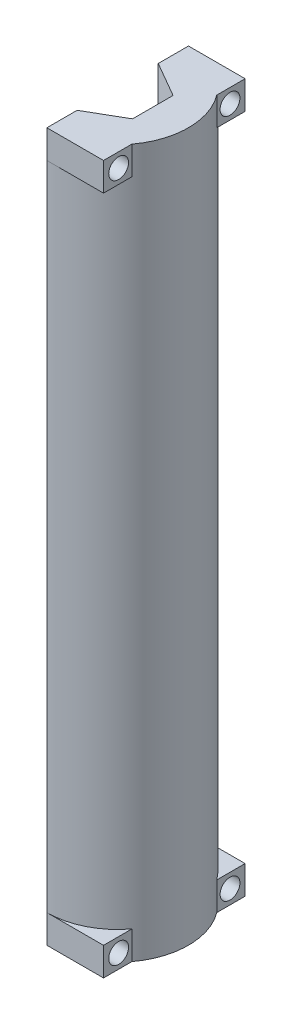
ISO-10303-21;
HEADER;
FILE_DESCRIPTION(('STEP AP214'),'2;1');
FILE_NAME('part.step','',(''),(''),'','','');
FILE_SCHEMA(('AUTOMOTIVE_DESIGN { 1 0 10303 214 1 1 1 1 }'));
ENDSEC;
DATA;
#1=APPLICATION_CONTEXT('core data for automotive mechanical design processes');
#2=APPLICATION_PROTOCOL_DEFINITION('international standard','automotive_design',2000,#1);
#3=PRODUCT_CONTEXT('',#1,'mechanical');
#4=PRODUCT('Part','Part','',(#3));
#5=PRODUCT_RELATED_PRODUCT_CATEGORY('part','',(#4));
#6=PRODUCT_DEFINITION_FORMATION('','',#4);
#7=PRODUCT_DEFINITION_CONTEXT('part definition',#1,'design');
#8=PRODUCT_DEFINITION('design','',#6,#7);
#9=PRODUCT_DEFINITION_SHAPE('','',#8);
#10=(LENGTH_UNIT() NAMED_UNIT(*) SI_UNIT(.MILLI.,.METRE.));
#11=(NAMED_UNIT(*) PLANE_ANGLE_UNIT() SI_UNIT($,.RADIAN.));
#12=(NAMED_UNIT(*) SI_UNIT($,.STERADIAN.) SOLID_ANGLE_UNIT());
#13=UNCERTAINTY_MEASURE_WITH_UNIT(LENGTH_MEASURE(1.E-05),#10,'distance_accuracy_value','');
#14=(GEOMETRIC_REPRESENTATION_CONTEXT(3) GLOBAL_UNCERTAINTY_ASSIGNED_CONTEXT((#13)) GLOBAL_UNIT_ASSIGNED_CONTEXT((#10,
#11,#12)) REPRESENTATION_CONTEXT('',''));
#15=CARTESIAN_POINT('',(0.,0.,0.));
#16=DIRECTION('',(0.,0.,1.));
#17=DIRECTION('',(1.,0.,0.));
#18=AXIS2_PLACEMENT_3D('',#15,#16,#17);
#19=CARTESIAN_POINT('',(0.,75.,0.));
#20=DIRECTION('',(0.,-1.,0.));
#21=DIRECTION('',(0.,0.,-1.));
#22=AXIS2_PLACEMENT_3D('',#19,#20,#21);
#23=CYLINDRICAL_SURFACE('',#22,7.5);
#24=CARTESIAN_POINT('',(0.,72.,0.));
#25=DIRECTION('',(0.,1.,0.));
#26=DIRECTION('',(0.,0.,1.));
#27=AXIS2_PLACEMENT_3D('',#24,#25,#26);
#28=CIRCLE('',#27,7.5);
#29=CARTESIAN_POINT('',(0.,72.,7.5));
#30=VERTEX_POINT('',#29);
#31=CARTESIAN_POINT('',(6.,72.,4.5));
#32=VERTEX_POINT('',#31);
#33=EDGE_CURVE('E178',#30,#32,#28,.T.);
#34=ORIENTED_EDGE('',*,*,#33,.F.);
#35=DIRECTION('',(0.,-1.,0.));
#36=VECTOR('',#35,1.);
#37=CARTESIAN_POINT('',(0.,75.,7.5));
#38=LINE('',#37,#36);
#39=CARTESIAN_POINT('',(0.,3.,7.5));
#40=VERTEX_POINT('',#39);
#41=EDGE_CURVE('E261',#30,#40,#38,.T.);
#42=ORIENTED_EDGE('',*,*,#41,.T.);
#43=CARTESIAN_POINT('',(0.,3.,0.));
#44=DIRECTION('',(0.,-1.,0.));
#45=DIRECTION('',(0.,0.,-1.));
#46=AXIS2_PLACEMENT_3D('',#43,#44,#45);
#47=CIRCLE('',#46,7.5);
#48=CARTESIAN_POINT('',(6.,3.,4.5));
#49=VERTEX_POINT('',#48);
#50=EDGE_CURVE('E199',#49,#40,#47,.T.);
#51=ORIENTED_EDGE('',*,*,#50,.F.);
#52=DIRECTION('',(0.,-1.,0.));
#53=VECTOR('',#52,1.);
#54=CARTESIAN_POINT('',(6.,75.,4.5));
#55=LINE('',#54,#53);
#56=CARTESIAN_POINT('',(6.,0.,4.5));
#57=VERTEX_POINT('',#56);
#58=EDGE_CURVE('E195',#49,#57,#55,.T.);
#59=ORIENTED_EDGE('',*,*,#58,.T.);
#60=CARTESIAN_POINT('',(0.,0.,0.));
#61=DIRECTION('',(0.,1.,0.));
#62=DIRECTION('',(0.,0.,-1.));
#63=AXIS2_PLACEMENT_3D('',#60,#61,#62);
#64=CIRCLE('',#63,7.5);
#65=CARTESIAN_POINT('',(6.,0.,-4.5));
#66=VERTEX_POINT('',#65);
#67=EDGE_CURVE('E249',#57,#66,#64,.T.);
#68=ORIENTED_EDGE('',*,*,#67,.T.);
#69=DIRECTION('',(0.,-1.,0.));
#70=VECTOR('',#69,1.);
#71=CARTESIAN_POINT('',(6.,75.,-4.5));
#72=LINE('',#71,#70);
#73=CARTESIAN_POINT('',(6.,3.,-4.5));
#74=VERTEX_POINT('',#73);
#75=EDGE_CURVE('E242',#66,#74,#72,.F.);
#76=ORIENTED_EDGE('',*,*,#75,.T.);
#77=CARTESIAN_POINT('',(0.,3.,0.));
#78=DIRECTION('',(0.,1.,0.));
#79=DIRECTION('',(0.,0.,1.));
#80=AXIS2_PLACEMENT_3D('',#77,#78,#79);
#81=CIRCLE('',#80,7.5);
#82=CARTESIAN_POINT('',(0.,3.,-7.5));
#83=VERTEX_POINT('',#82);
#84=EDGE_CURVE('E246',#74,#83,#81,.T.);
#85=ORIENTED_EDGE('',*,*,#84,.T.);
#86=DIRECTION('',(0.,-1.,0.));
#87=VECTOR('',#86,1.);
#88=CARTESIAN_POINT('',(0.,75.,-7.5));
#89=LINE('',#88,#87);
#90=CARTESIAN_POINT('',(0.,72.,-7.5));
#91=VERTEX_POINT('',#90);
#92=EDGE_CURVE('E41',#91,#83,#89,.T.);
#93=ORIENTED_EDGE('',*,*,#92,.F.);
#94=CARTESIAN_POINT('',(0.,72.,0.));
#95=DIRECTION('',(0.,-1.,0.));
#96=DIRECTION('',(0.,0.,-1.));
#97=AXIS2_PLACEMENT_3D('',#94,#95,#96);
#98=CIRCLE('',#97,7.5);
#99=CARTESIAN_POINT('',(6.,72.,-4.5));
#100=VERTEX_POINT('',#99);
#101=EDGE_CURVE('E224',#91,#100,#98,.T.);
#102=ORIENTED_EDGE('',*,*,#101,.T.);
#103=DIRECTION('',(0.,-1.,0.));
#104=VECTOR('',#103,1.);
#105=CARTESIAN_POINT('',(6.,75.,-4.5));
#106=LINE('',#105,#104);
#107=CARTESIAN_POINT('',(6.,75.,-4.5));
#108=VERTEX_POINT('',#107);
#109=EDGE_CURVE('E221',#108,#100,#106,.T.);
#110=ORIENTED_EDGE('',*,*,#109,.F.);
#111=CARTESIAN_POINT('',(0.,75.,0.));
#112=DIRECTION('',(0.,1.,0.));
#113=DIRECTION('',(0.,0.,-1.));
#114=AXIS2_PLACEMENT_3D('',#111,#112,#113);
#115=CIRCLE('',#114,7.5);
#116=CARTESIAN_POINT('',(6.,75.,4.5));
#117=VERTEX_POINT('',#116);
#118=EDGE_CURVE('E54',#117,#108,#115,.T.);
#119=ORIENTED_EDGE('',*,*,#118,.F.);
#120=DIRECTION('',(0.,-1.,0.));
#121=VECTOR('',#120,1.);
#122=CARTESIAN_POINT('',(6.,75.,4.5));
#123=LINE('',#122,#121);
#124=EDGE_CURVE('E49',#32,#117,#123,.F.);
#125=ORIENTED_EDGE('',*,*,#124,.F.);
#126=EDGE_LOOP('',(#34,#42,#51,#59,#68,#76,#85,#93,#102,#110,#119,#125));
#127=FACE_BOUND('',#126,.T.);
#128=ADVANCED_FACE('F33',(#127),#23,.T.);
#129=CARTESIAN_POINT('',(0.,75.,-7.5));
#130=DIRECTION('',(1.,0.,0.));
#131=DIRECTION('',(0.,0.,-1.));
#132=AXIS2_PLACEMENT_3D('',#129,#130,#131);
#133=PLANE('',#132);
#134=CARTESIAN_POINT('',(0.,1.5,-5.89774300138541));
#135=DIRECTION('',(-1.,0.,0.));
#136=DIRECTION('',(0.,0.,1.));
#137=AXIS2_PLACEMENT_3D('',#134,#135,#136);
#138=CIRCLE('',#137,1.05);
#139=CARTESIAN_POINT('',(0.,1.5,-4.84774300138541));
#140=VERTEX_POINT('',#139);
#141=EDGE_CURVE('E202',#140,#140,#138,.T.);
#142=ORIENTED_EDGE('',*,*,#141,.F.);
#143=EDGE_LOOP('',(#142));
#144=FACE_BOUND('',#143,.T.);
#145=CARTESIAN_POINT('',(0.,73.5,-5.89774300138541));
#146=DIRECTION('',(-1.,0.,0.));
#147=DIRECTION('',(0.,0.,1.));
#148=AXIS2_PLACEMENT_3D('',#145,#146,#147);
#149=CIRCLE('',#148,1.05);
#150=CARTESIAN_POINT('',(0.,73.5,-4.84774300138541));
#151=VERTEX_POINT('',#150);
#152=EDGE_CURVE('E206',#151,#151,#149,.T.);
#153=ORIENTED_EDGE('',*,*,#152,.F.);
#154=EDGE_LOOP('',(#153));
#155=FACE_BOUND('',#154,.T.);
#156=DIRECTION('',(0.,0.,1.));
#157=VECTOR('',#156,1.);
#158=CARTESIAN_POINT('',(0.,0.,-7.5));
#159=LINE('',#158,#157);
#160=CARTESIAN_POINT('',(0.,0.,-7.5));
#161=VERTEX_POINT('',#160);
#162=CARTESIAN_POINT('',(0.,0.,-4.29548600277082));
#163=VERTEX_POINT('',#162);
#164=EDGE_CURVE('E263',#161,#163,#159,.T.);
#165=ORIENTED_EDGE('',*,*,#164,.T.);
#166=DIRECTION('',(0.,-1.,0.));
#167=VECTOR('',#166,1.);
#168=CARTESIAN_POINT('',(0.,75.,-4.29548600277082));
#169=LINE('',#168,#167);
#170=CARTESIAN_POINT('',(0.,75.,-4.29548600277082));
#171=VERTEX_POINT('',#170);
#172=EDGE_CURVE('E284',#171,#163,#169,.T.);
#173=ORIENTED_EDGE('',*,*,#172,.F.);
#174=DIRECTION('',(0.,0.,1.));
#175=VECTOR('',#174,1.);
#176=CARTESIAN_POINT('',(0.,75.,-7.5));
#177=LINE('',#176,#175);
#178=CARTESIAN_POINT('',(0.,75.,-7.5));
#179=VERTEX_POINT('',#178);
#180=EDGE_CURVE('E251',#179,#171,#177,.T.);
#181=ORIENTED_EDGE('',*,*,#180,.F.);
#182=EDGE_CURVE('E11',#179,#91,#89,.T.);
#183=ORIENTED_EDGE('',*,*,#182,.T.);
#184=ORIENTED_EDGE('',*,*,#92,.T.);
#185=DIRECTION('',(0.,-1.,0.));
#186=VECTOR('',#185,1.);
#187=CARTESIAN_POINT('',(0.,0.,-7.5));
#188=LINE('',#187,#186);
#189=EDGE_CURVE('E227',#83,#161,#188,.T.);
#190=ORIENTED_EDGE('',*,*,#189,.T.);
#191=EDGE_LOOP('',(#165,#173,#181,#183,#184,#190));
#192=FACE_BOUND('',#191,.T.);
#193=ADVANCED_FACE('F314',(#144,#155,#192),#133,.F.);
#194=CARTESIAN_POINT('',(3.72,75.,-2.14774300138541));
#195=DIRECTION('',(0.5,0.,-0.866025403784439));
#196=DIRECTION('',(-0.866025403784439,0.,-0.5));
#197=AXIS2_PLACEMENT_3D('',#194,#195,#196);
#198=PLANE('',#197);
#199=DIRECTION('',(0.866025403784439,0.,0.5));
#200=VECTOR('',#199,1.);
#201=CARTESIAN_POINT('',(3.72,0.,-2.14774300138541));
#202=LINE('',#201,#200);
#203=CARTESIAN_POINT('',(3.72,0.,-2.14774300138541));
#204=VERTEX_POINT('',#203);
#205=EDGE_CURVE('E266',#163,#204,#202,.T.);
#206=ORIENTED_EDGE('',*,*,#205,.T.);
#207=DIRECTION('',(0.,-1.,0.));
#208=VECTOR('',#207,1.);
#209=CARTESIAN_POINT('',(3.72,75.,-2.14774300138541));
#210=LINE('',#209,#208);
#211=CARTESIAN_POINT('',(3.72,75.,-2.14774300138541));
#212=VERTEX_POINT('',#211);
#213=EDGE_CURVE('E281',#212,#204,#210,.T.);
#214=ORIENTED_EDGE('',*,*,#213,.F.);
#215=DIRECTION('',(0.866025403784439,0.,0.5));
#216=VECTOR('',#215,1.);
#217=CARTESIAN_POINT('',(3.72,75.,-2.14774300138541));
#218=LINE('',#217,#216);
#219=EDGE_CURVE('E254',#171,#212,#218,.T.);
#220=ORIENTED_EDGE('',*,*,#219,.F.);
#221=ORIENTED_EDGE('',*,*,#172,.T.);
#222=EDGE_LOOP('',(#206,#214,#220,#221));
#223=FACE_BOUND('',#222,.T.);
#224=ADVANCED_FACE('F326',(#223),#198,.F.);
#225=CARTESIAN_POINT('',(3.72,75.,2.14774300138541));
#226=DIRECTION('',(1.,0.,0.));
#227=DIRECTION('',(0.,0.,-1.));
#228=AXIS2_PLACEMENT_3D('',#225,#226,#227);
#229=PLANE('',#228);
#230=DIRECTION('',(0.,0.,1.));
#231=VECTOR('',#230,1.);
#232=CARTESIAN_POINT('',(3.72,0.,2.14774300138541));
#233=LINE('',#232,#231);
#234=CARTESIAN_POINT('',(3.72,0.,2.14774300138541));
#235=VERTEX_POINT('',#234);
#236=EDGE_CURVE('E268',#204,#235,#233,.T.);
#237=ORIENTED_EDGE('',*,*,#236,.T.);
#238=DIRECTION('',(0.,-1.,0.));
#239=VECTOR('',#238,1.);
#240=CARTESIAN_POINT('',(3.72,75.,2.14774300138541));
#241=LINE('',#240,#239);
#242=CARTESIAN_POINT('',(3.72,75.,2.14774300138541));
#243=VERTEX_POINT('',#242);
#244=EDGE_CURVE('E278',#243,#235,#241,.T.);
#245=ORIENTED_EDGE('',*,*,#244,.F.);
#246=DIRECTION('',(0.,0.,1.));
#247=VECTOR('',#246,1.);
#248=CARTESIAN_POINT('',(3.72,75.,2.14774300138541));
#249=LINE('',#248,#247);
#250=EDGE_CURVE('E256',#212,#243,#249,.T.);
#251=ORIENTED_EDGE('',*,*,#250,.F.);
#252=ORIENTED_EDGE('',*,*,#213,.T.);
#253=EDGE_LOOP('',(#237,#245,#251,#252));
#254=FACE_BOUND('',#253,.T.);
#255=ADVANCED_FACE('F332',(#254),#229,.F.);
#256=CARTESIAN_POINT('',(0.,75.,4.29548600277082));
#257=DIRECTION('',(0.5,0.,0.866025403784439));
#258=DIRECTION('',(0.866025403784439,0.,-0.5));
#259=AXIS2_PLACEMENT_3D('',#256,#257,#258);
#260=PLANE('',#259);
#261=DIRECTION('',(-0.866025403784439,0.,0.5));
#262=VECTOR('',#261,1.);
#263=CARTESIAN_POINT('',(0.,0.,4.29548600277082));
#264=LINE('',#263,#262);
#265=CARTESIAN_POINT('',(0.,0.,4.29548600277082));
#266=VERTEX_POINT('',#265);
#267=EDGE_CURVE('E270',#235,#266,#264,.T.);
#268=ORIENTED_EDGE('',*,*,#267,.T.);
#269=DIRECTION('',(0.,-1.,0.));
#270=VECTOR('',#269,1.);
#271=CARTESIAN_POINT('',(0.,75.,4.29548600277082));
#272=LINE('',#271,#270);
#273=CARTESIAN_POINT('',(0.,75.,4.29548600277082));
#274=VERTEX_POINT('',#273);
#275=EDGE_CURVE('E276',#274,#266,#272,.T.);
#276=ORIENTED_EDGE('',*,*,#275,.F.);
#277=DIRECTION('',(-0.866025403784439,0.,0.5));
#278=VECTOR('',#277,1.);
#279=CARTESIAN_POINT('',(0.,75.,4.29548600277082));
#280=LINE('',#279,#278);
#281=EDGE_CURVE('E258',#243,#274,#280,.T.);
#282=ORIENTED_EDGE('',*,*,#281,.F.);
#283=ORIENTED_EDGE('',*,*,#244,.T.);
#284=EDGE_LOOP('',(#268,#276,#282,#283));
#285=FACE_BOUND('',#284,.T.);
#286=ADVANCED_FACE('F340',(#285),#260,.F.);
#287=CARTESIAN_POINT('',(0.,75.,4.29548600277082));
#288=DIRECTION('',(1.,0.,0.));
#289=DIRECTION('',(0.,0.,-1.));
#290=AXIS2_PLACEMENT_3D('',#287,#288,#289);
#291=PLANE('',#290);
#292=CARTESIAN_POINT('',(0.,1.5,5.89774300138541));
#293=DIRECTION('',(1.,0.,0.));
#294=DIRECTION('',(0.,0.,-1.));
#295=AXIS2_PLACEMENT_3D('',#292,#293,#294);
#296=CIRCLE('',#295,1.05);
#297=CARTESIAN_POINT('',(0.,1.5,4.84774300138541));
#298=VERTEX_POINT('',#297);
#299=EDGE_CURVE('E409',#298,#298,#296,.T.);
#300=ORIENTED_EDGE('',*,*,#299,.T.);
#301=EDGE_LOOP('',(#300));
#302=FACE_BOUND('',#301,.T.);
#303=CARTESIAN_POINT('',(0.,73.5,5.89774300138541));
#304=DIRECTION('',(1.,0.,0.));
#305=DIRECTION('',(0.,0.,-1.));
#306=AXIS2_PLACEMENT_3D('',#303,#304,#305);
#307=CIRCLE('',#306,1.05);
#308=CARTESIAN_POINT('',(0.,73.5,4.84774300138541));
#309=VERTEX_POINT('',#308);
#310=EDGE_CURVE('E171',#309,#309,#307,.T.);
#311=ORIENTED_EDGE('',*,*,#310,.T.);
#312=EDGE_LOOP('',(#311));
#313=FACE_BOUND('',#312,.T.);
#314=ORIENTED_EDGE('',*,*,#275,.T.);
#315=DIRECTION('',(0.,0.,1.));
#316=VECTOR('',#315,1.);
#317=CARTESIAN_POINT('',(0.,0.,4.29548600277082));
#318=LINE('',#317,#316);
#319=CARTESIAN_POINT('',(0.,0.,7.5));
#320=VERTEX_POINT('',#319);
#321=EDGE_CURVE('E252',#266,#320,#318,.T.);
#322=ORIENTED_EDGE('',*,*,#321,.T.);
#323=DIRECTION('',(0.,-1.,0.));
#324=VECTOR('',#323,1.);
#325=CARTESIAN_POINT('',(0.,0.,7.5));
#326=LINE('',#325,#324);
#327=EDGE_CURVE('E180',#40,#320,#326,.T.);
#328=ORIENTED_EDGE('',*,*,#327,.F.);
#329=ORIENTED_EDGE('',*,*,#41,.F.);
#330=CARTESIAN_POINT('',(0.,75.,7.5));
#331=VERTEX_POINT('',#330);
#332=EDGE_CURVE('E274',#331,#30,#38,.T.);
#333=ORIENTED_EDGE('',*,*,#332,.F.);
#334=DIRECTION('',(0.,0.,1.));
#335=VECTOR('',#334,1.);
#336=CARTESIAN_POINT('',(0.,75.,4.29548600277082));
#337=LINE('',#336,#335);
#338=EDGE_CURVE('E160',#274,#331,#337,.T.);
#339=ORIENTED_EDGE('',*,*,#338,.F.);
#340=EDGE_LOOP('',(#314,#322,#328,#329,#333,#339));
#341=FACE_BOUND('',#340,.T.);
#342=ADVANCED_FACE('F343',(#302,#313,#341),#291,.F.);
#343=CARTESIAN_POINT('',(0.,75.,0.));
#344=DIRECTION('',(0.,-1.,0.));
#345=DIRECTION('',(0.,0.,-1.));
#346=AXIS2_PLACEMENT_3D('',#343,#344,#345);
#347=PLANE('',#346);
#348=ORIENTED_EDGE('',*,*,#281,.T.);
#349=ORIENTED_EDGE('',*,*,#338,.T.);
#350=DIRECTION('',(-1.,0.,0.));
#351=VECTOR('',#350,1.);
#352=CARTESIAN_POINT('',(6.,75.,7.5));
#353=LINE('',#352,#351);
#354=CARTESIAN_POINT('',(6.,75.,7.5));
#355=VERTEX_POINT('',#354);
#356=EDGE_CURVE('E157',#355,#331,#353,.T.);
#357=ORIENTED_EDGE('',*,*,#356,.F.);
#358=DIRECTION('',(0.,0.,1.));
#359=VECTOR('',#358,1.);
#360=CARTESIAN_POINT('',(6.,75.,7.5));
#361=LINE('',#360,#359);
#362=EDGE_CURVE('E146',#117,#355,#361,.T.);
#363=ORIENTED_EDGE('',*,*,#362,.F.);
#364=ORIENTED_EDGE('',*,*,#118,.T.);
#365=DIRECTION('',(0.,0.,-1.));
#366=VECTOR('',#365,1.);
#367=CARTESIAN_POINT('',(6.,75.,-7.5));
#368=LINE('',#367,#366);
#369=CARTESIAN_POINT('',(6.,75.,-7.5));
#370=VERTEX_POINT('',#369);
#371=EDGE_CURVE('E216',#108,#370,#368,.T.);
#372=ORIENTED_EDGE('',*,*,#371,.T.);
#373=DIRECTION('',(-1.,0.,0.));
#374=VECTOR('',#373,1.);
#375=CARTESIAN_POINT('',(6.,75.,-7.5));
#376=LINE('',#375,#374);
#377=EDGE_CURVE('E219',#370,#179,#376,.T.);
#378=ORIENTED_EDGE('',*,*,#377,.T.);
#379=ORIENTED_EDGE('',*,*,#180,.T.);
#380=ORIENTED_EDGE('',*,*,#219,.T.);
#381=ORIENTED_EDGE('',*,*,#250,.T.);
#382=EDGE_LOOP('',(#348,#349,#357,#363,#364,#372,#378,#379,#380,#381));
#383=FACE_BOUND('',#382,.T.);
#384=ADVANCED_FACE('F158',(#383),#347,.F.);
#385=CARTESIAN_POINT('',(0.,0.,0.));
#386=DIRECTION('',(0.,-1.,0.));
#387=DIRECTION('',(0.,0.,-1.));
#388=AXIS2_PLACEMENT_3D('',#385,#386,#387);
#389=PLANE('',#388);
#390=ORIENTED_EDGE('',*,*,#321,.F.);
#391=ORIENTED_EDGE('',*,*,#267,.F.);
#392=ORIENTED_EDGE('',*,*,#236,.F.);
#393=ORIENTED_EDGE('',*,*,#205,.F.);
#394=ORIENTED_EDGE('',*,*,#164,.F.);
#395=DIRECTION('',(-1.,0.,0.));
#396=VECTOR('',#395,1.);
#397=CARTESIAN_POINT('',(6.,0.,-7.5));
#398=LINE('',#397,#396);
#399=CARTESIAN_POINT('',(6.,0.,-7.5));
#400=VERTEX_POINT('',#399);
#401=EDGE_CURVE('E236',#400,#161,#398,.T.);
#402=ORIENTED_EDGE('',*,*,#401,.F.);
#403=DIRECTION('',(0.,0.,1.));
#404=VECTOR('',#403,1.);
#405=CARTESIAN_POINT('',(6.,0.,-7.5));
#406=LINE('',#405,#404);
#407=EDGE_CURVE('E231',#400,#66,#406,.T.);
#408=ORIENTED_EDGE('',*,*,#407,.T.);
#409=ORIENTED_EDGE('',*,*,#67,.F.);
#410=DIRECTION('',(0.,0.,-1.));
#411=VECTOR('',#410,1.);
#412=CARTESIAN_POINT('',(6.,0.,7.5));
#413=LINE('',#412,#411);
#414=CARTESIAN_POINT('',(6.,0.,7.5));
#415=VERTEX_POINT('',#414);
#416=EDGE_CURVE('E186',#415,#57,#413,.T.);
#417=ORIENTED_EDGE('',*,*,#416,.F.);
#418=DIRECTION('',(-1.,0.,0.));
#419=VECTOR('',#418,1.);
#420=CARTESIAN_POINT('',(6.,0.,7.5));
#421=LINE('',#420,#419);
#422=EDGE_CURVE('E192',#415,#320,#421,.T.);
#423=ORIENTED_EDGE('',*,*,#422,.T.);
#424=EDGE_LOOP('',(#390,#391,#392,#393,#394,#402,#408,#409,#417,#423));
#425=FACE_BOUND('',#424,.T.);
#426=ADVANCED_FACE('F307',(#425),#389,.T.);
#427=CARTESIAN_POINT('',(6.,3.,-7.5));
#428=DIRECTION('',(0.,1.,0.));
#429=DIRECTION('',(0.,0.,1.));
#430=AXIS2_PLACEMENT_3D('',#427,#428,#429);
#431=PLANE('',#430);
#432=ORIENTED_EDGE('',*,*,#84,.F.);
#433=DIRECTION('',(0.,0.,-1.));
#434=VECTOR('',#433,1.);
#435=CARTESIAN_POINT('',(6.,3.,-7.5));
#436=LINE('',#435,#434);
#437=CARTESIAN_POINT('',(6.,3.,-7.5));
#438=VERTEX_POINT('',#437);
#439=EDGE_CURVE('E234',#74,#438,#436,.T.);
#440=ORIENTED_EDGE('',*,*,#439,.T.);
#441=DIRECTION('',(-1.,0.,0.));
#442=VECTOR('',#441,1.);
#443=CARTESIAN_POINT('',(6.,3.,-7.5));
#444=LINE('',#443,#442);
#445=EDGE_CURVE('E239',#438,#83,#444,.T.);
#446=ORIENTED_EDGE('',*,*,#445,.T.);
#447=EDGE_LOOP('',(#432,#440,#446));
#448=FACE_BOUND('',#447,.T.);
#449=ADVANCED_FACE('F298',(#448),#431,.T.);
#450=CARTESIAN_POINT('',(6.,0.,0.));
#451=DIRECTION('',(1.,0.,0.));
#452=DIRECTION('',(0.,0.,-1.));
#453=AXIS2_PLACEMENT_3D('',#450,#451,#452);
#454=PLANE('',#453);
#455=CARTESIAN_POINT('',(6.,1.5,-5.89774300138541));
#456=DIRECTION('',(1.,0.,0.));
#457=DIRECTION('',(0.,0.,-1.));
#458=AXIS2_PLACEMENT_3D('',#455,#456,#457);
#459=CIRCLE('',#458,1.05);
#460=CARTESIAN_POINT('',(6.,1.5,-6.94774300138541));
#461=VERTEX_POINT('',#460);
#462=EDGE_CURVE('E205',#461,#461,#459,.T.);
#463=ORIENTED_EDGE('',*,*,#462,.F.);
#464=EDGE_LOOP('',(#463));
#465=FACE_BOUND('',#464,.T.);
#466=ORIENTED_EDGE('',*,*,#75,.F.);
#467=ORIENTED_EDGE('',*,*,#407,.F.);
#468=DIRECTION('',(0.,-1.,0.));
#469=VECTOR('',#468,1.);
#470=CARTESIAN_POINT('',(6.,0.,-7.5));
#471=LINE('',#470,#469);
#472=EDGE_CURVE('E228',#438,#400,#471,.T.);
#473=ORIENTED_EDGE('',*,*,#472,.F.);
#474=ORIENTED_EDGE('',*,*,#439,.F.);
#475=EDGE_LOOP('',(#466,#467,#473,#474));
#476=FACE_BOUND('',#475,.T.);
#477=ADVANCED_FACE('F294',(#465,#476),#454,.T.);
#478=CARTESIAN_POINT('',(6.,0.,-7.5));
#479=DIRECTION('',(0.,0.,-1.));
#480=DIRECTION('',(-1.,0.,0.));
#481=AXIS2_PLACEMENT_3D('',#478,#479,#480);
#482=PLANE('',#481);
#483=ORIENTED_EDGE('',*,*,#189,.F.);
#484=ORIENTED_EDGE('',*,*,#445,.F.);
#485=ORIENTED_EDGE('',*,*,#472,.T.);
#486=ORIENTED_EDGE('',*,*,#401,.T.);
#487=EDGE_LOOP('',(#483,#484,#485,#486));
#488=FACE_BOUND('',#487,.T.);
#489=ADVANCED_FACE('F297',(#488),#482,.T.);
#490=CARTESIAN_POINT('',(6.,72.,-7.5));
#491=DIRECTION('',(0.,-1.,0.));
#492=DIRECTION('',(0.,0.,-1.));
#493=AXIS2_PLACEMENT_3D('',#490,#491,#492);
#494=PLANE('',#493);
#495=ORIENTED_EDGE('',*,*,#101,.F.);
#496=DIRECTION('',(-1.,0.,0.));
#497=VECTOR('',#496,1.);
#498=CARTESIAN_POINT('',(6.,72.,-7.5));
#499=LINE('',#498,#497);
#500=CARTESIAN_POINT('',(6.,72.,-7.5));
#501=VERTEX_POINT('',#500);
#502=EDGE_CURVE('E218',#501,#91,#499,.T.);
#503=ORIENTED_EDGE('',*,*,#502,.F.);
#504=DIRECTION('',(0.,0.,1.));
#505=VECTOR('',#504,1.);
#506=CARTESIAN_POINT('',(6.,72.,-7.5));
#507=LINE('',#506,#505);
#508=EDGE_CURVE('E213',#501,#100,#507,.T.);
#509=ORIENTED_EDGE('',*,*,#508,.T.);
#510=EDGE_LOOP('',(#495,#503,#509));
#511=FACE_BOUND('',#510,.T.);
#512=ADVANCED_FACE('F354',(#511),#494,.T.);
#513=CARTESIAN_POINT('',(6.,0.,0.));
#514=DIRECTION('',(-1.,0.,0.));
#515=DIRECTION('',(0.,0.,1.));
#516=AXIS2_PLACEMENT_3D('',#513,#514,#515);
#517=PLANE('',#516);
#518=CARTESIAN_POINT('',(6.,73.5,-5.89774300138541));
#519=DIRECTION('',(-1.,0.,0.));
#520=DIRECTION('',(0.,0.,1.));
#521=AXIS2_PLACEMENT_3D('',#518,#519,#520);
#522=CIRCLE('',#521,1.05);
#523=CARTESIAN_POINT('',(6.,73.5,-4.84774300138541));
#524=VERTEX_POINT('',#523);
#525=EDGE_CURVE('E209',#524,#524,#522,.T.);
#526=ORIENTED_EDGE('',*,*,#525,.T.);
#527=EDGE_LOOP('',(#526));
#528=FACE_BOUND('',#527,.T.);
#529=ORIENTED_EDGE('',*,*,#371,.F.);
#530=ORIENTED_EDGE('',*,*,#109,.T.);
#531=ORIENTED_EDGE('',*,*,#508,.F.);
#532=DIRECTION('',(0.,-1.,0.));
#533=VECTOR('',#532,1.);
#534=CARTESIAN_POINT('',(6.,75.,-7.5));
#535=LINE('',#534,#533);
#536=EDGE_CURVE('E210',#370,#501,#535,.T.);
#537=ORIENTED_EDGE('',*,*,#536,.F.);
#538=EDGE_LOOP('',(#529,#530,#531,#537));
#539=FACE_BOUND('',#538,.T.);
#540=ADVANCED_FACE('F361',(#528,#539),#517,.F.);
#541=CARTESIAN_POINT('',(6.,75.,-7.5));
#542=DIRECTION('',(0.,0.,-1.));
#543=DIRECTION('',(-1.,0.,0.));
#544=AXIS2_PLACEMENT_3D('',#541,#542,#543);
#545=PLANE('',#544);
#546=ORIENTED_EDGE('',*,*,#182,.F.);
#547=ORIENTED_EDGE('',*,*,#377,.F.);
#548=ORIENTED_EDGE('',*,*,#536,.T.);
#549=ORIENTED_EDGE('',*,*,#502,.T.);
#550=EDGE_LOOP('',(#546,#547,#548,#549));
#551=FACE_BOUND('',#550,.T.);
#552=ADVANCED_FACE('F357',(#551),#545,.T.);
#553=CARTESIAN_POINT('',(7.5,73.5,-5.89774300138541));
#554=DIRECTION('',(-1.,0.,0.));
#555=DIRECTION('',(0.,0.,1.));
#556=AXIS2_PLACEMENT_3D('',#553,#554,#555);
#557=CYLINDRICAL_SURFACE('',#556,1.05);
#558=ORIENTED_EDGE('',*,*,#152,.T.);
#559=EDGE_LOOP('',(#558));
#560=FACE_BOUND('',#559,.T.);
#561=ORIENTED_EDGE('',*,*,#525,.F.);
#562=EDGE_LOOP('',(#561));
#563=FACE_BOUND('',#562,.T.);
#564=ADVANCED_FACE('F360',(#560,#563),#557,.F.);
#565=CARTESIAN_POINT('',(7.5,1.5,-5.89774300138541));
#566=DIRECTION('',(-1.,0.,0.));
#567=DIRECTION('',(0.,0.,1.));
#568=AXIS2_PLACEMENT_3D('',#565,#566,#567);
#569=CYLINDRICAL_SURFACE('',#568,1.05);
#570=ORIENTED_EDGE('',*,*,#462,.T.);
#571=EDGE_LOOP('',(#570));
#572=FACE_BOUND('',#571,.T.);
#573=ORIENTED_EDGE('',*,*,#141,.T.);
#574=EDGE_LOOP('',(#573));
#575=FACE_BOUND('',#574,.T.);
#576=ADVANCED_FACE('F291',(#572,#575),#569,.F.);
#577=CARTESIAN_POINT('',(6.,3.,7.5));
#578=DIRECTION('',(0.,-1.,0.));
#579=DIRECTION('',(0.,0.,-1.));
#580=AXIS2_PLACEMENT_3D('',#577,#578,#579);
#581=PLANE('',#580);
#582=DIRECTION('',(0.,0.,1.));
#583=VECTOR('',#582,1.);
#584=CARTESIAN_POINT('',(6.,3.,7.5));
#585=LINE('',#584,#583);
#586=CARTESIAN_POINT('',(6.,3.,7.5));
#587=VERTEX_POINT('',#586);
#588=EDGE_CURVE('E184',#49,#587,#585,.T.);
#589=ORIENTED_EDGE('',*,*,#588,.F.);
#590=ORIENTED_EDGE('',*,*,#50,.T.);
#591=DIRECTION('',(-1.,0.,0.));
#592=VECTOR('',#591,1.);
#593=CARTESIAN_POINT('',(6.,3.,7.5));
#594=LINE('',#593,#592);
#595=EDGE_CURVE('E189',#587,#40,#594,.T.);
#596=ORIENTED_EDGE('',*,*,#595,.F.);
#597=EDGE_LOOP('',(#589,#590,#596));
#598=FACE_BOUND('',#597,.T.);
#599=ADVANCED_FACE('F374',(#598),#581,.F.);
#600=CARTESIAN_POINT('',(6.,0.,0.));
#601=DIRECTION('',(1.,0.,0.));
#602=DIRECTION('',(0.,0.,1.));
#603=AXIS2_PLACEMENT_3D('',#600,#601,#602);
#604=PLANE('',#603);
#605=CARTESIAN_POINT('',(6.,1.5,5.89774300138541));
#606=DIRECTION('',(1.,0.,0.));
#607=DIRECTION('',(0.,0.,-1.));
#608=AXIS2_PLACEMENT_3D('',#605,#606,#607);
#609=CIRCLE('',#608,1.05);
#610=CARTESIAN_POINT('',(6.,1.5,4.84774300138541));
#611=VERTEX_POINT('',#610);
#612=EDGE_CURVE('E36',#611,#611,#609,.F.);
#613=ORIENTED_EDGE('',*,*,#612,.T.);
#614=EDGE_LOOP('',(#613));
#615=FACE_BOUND('',#614,.T.);
#616=ORIENTED_EDGE('',*,*,#58,.F.);
#617=ORIENTED_EDGE('',*,*,#588,.T.);
#618=DIRECTION('',(0.,-1.,0.));
#619=VECTOR('',#618,1.);
#620=CARTESIAN_POINT('',(6.,0.,7.5));
#621=LINE('',#620,#619);
#622=EDGE_CURVE('E181',#587,#415,#621,.T.);
#623=ORIENTED_EDGE('',*,*,#622,.T.);
#624=ORIENTED_EDGE('',*,*,#416,.T.);
#625=EDGE_LOOP('',(#616,#617,#623,#624));
#626=FACE_BOUND('',#625,.T.);
#627=ADVANCED_FACE('F379',(#615,#626),#604,.T.);
#628=CARTESIAN_POINT('',(6.,0.,7.5));
#629=DIRECTION('',(0.,0.,-1.));
#630=DIRECTION('',(-1.,0.,0.));
#631=AXIS2_PLACEMENT_3D('',#628,#629,#630);
#632=PLANE('',#631);
#633=ORIENTED_EDGE('',*,*,#327,.T.);
#634=ORIENTED_EDGE('',*,*,#422,.F.);
#635=ORIENTED_EDGE('',*,*,#622,.F.);
#636=ORIENTED_EDGE('',*,*,#595,.T.);
#637=EDGE_LOOP('',(#633,#634,#635,#636));
#638=FACE_BOUND('',#637,.T.);
#639=ADVANCED_FACE('F375',(#638),#632,.F.);
#640=CARTESIAN_POINT('',(6.,72.,7.5));
#641=DIRECTION('',(0.,1.,0.));
#642=DIRECTION('',(0.,0.,1.));
#643=AXIS2_PLACEMENT_3D('',#640,#641,#642);
#644=PLANE('',#643);
#645=DIRECTION('',(-1.,0.,0.));
#646=VECTOR('',#645,1.);
#647=CARTESIAN_POINT('',(6.,72.,7.5));
#648=LINE('',#647,#646);
#649=CARTESIAN_POINT('',(6.,72.,7.5));
#650=VERTEX_POINT('',#649);
#651=EDGE_CURVE('E164',#650,#30,#648,.T.);
#652=ORIENTED_EDGE('',*,*,#651,.T.);
#653=ORIENTED_EDGE('',*,*,#33,.T.);
#654=DIRECTION('',(0.,0.,-1.));
#655=VECTOR('',#654,1.);
#656=CARTESIAN_POINT('',(6.,72.,7.5));
#657=LINE('',#656,#655);
#658=EDGE_CURVE('E154',#650,#32,#657,.T.);
#659=ORIENTED_EDGE('',*,*,#658,.F.);
#660=EDGE_LOOP('',(#652,#653,#659));
#661=FACE_BOUND('',#660,.T.);
#662=ADVANCED_FACE('F378',(#661),#644,.F.);
#663=CARTESIAN_POINT('',(6.,0.,0.));
#664=DIRECTION('',(-1.,0.,0.));
#665=DIRECTION('',(0.,0.,-1.));
#666=AXIS2_PLACEMENT_3D('',#663,#664,#665);
#667=PLANE('',#666);
#668=CARTESIAN_POINT('',(6.,73.5,5.89774300138541));
#669=DIRECTION('',(-1.,0.,0.));
#670=DIRECTION('',(0.,0.,1.));
#671=AXIS2_PLACEMENT_3D('',#668,#669,#670);
#672=CIRCLE('',#671,1.05);
#673=CARTESIAN_POINT('',(6.,73.5,6.94774300138541));
#674=VERTEX_POINT('',#673);
#675=EDGE_CURVE('E168',#674,#674,#672,.F.);
#676=ORIENTED_EDGE('',*,*,#675,.F.);
#677=EDGE_LOOP('',(#676));
#678=FACE_BOUND('',#677,.T.);
#679=ORIENTED_EDGE('',*,*,#658,.T.);
#680=ORIENTED_EDGE('',*,*,#124,.T.);
#681=ORIENTED_EDGE('',*,*,#362,.T.);
#682=DIRECTION('',(0.,-1.,0.));
#683=VECTOR('',#682,1.);
#684=CARTESIAN_POINT('',(6.,75.,7.5));
#685=LINE('',#684,#683);
#686=EDGE_CURVE('E151',#355,#650,#685,.T.);
#687=ORIENTED_EDGE('',*,*,#686,.T.);
#688=EDGE_LOOP('',(#679,#680,#681,#687));
#689=FACE_BOUND('',#688,.T.);
#690=ADVANCED_FACE('F149',(#678,#689),#667,.F.);
#691=CARTESIAN_POINT('',(6.,75.,7.5));
#692=DIRECTION('',(0.,0.,-1.));
#693=DIRECTION('',(-1.,0.,0.));
#694=AXIS2_PLACEMENT_3D('',#691,#692,#693);
#695=PLANE('',#694);
#696=ORIENTED_EDGE('',*,*,#332,.T.);
#697=ORIENTED_EDGE('',*,*,#651,.F.);
#698=ORIENTED_EDGE('',*,*,#686,.F.);
#699=ORIENTED_EDGE('',*,*,#356,.T.);
#700=EDGE_LOOP('',(#696,#697,#698,#699));
#701=FACE_BOUND('',#700,.T.);
#702=ADVANCED_FACE('F166',(#701),#695,.F.);
#703=CARTESIAN_POINT('',(7.5,73.5,5.89774300138541));
#704=DIRECTION('',(-1.,0.,0.));
#705=DIRECTION('',(0.,0.,1.));
#706=AXIS2_PLACEMENT_3D('',#703,#704,#705);
#707=CYLINDRICAL_SURFACE('',#706,1.05);
#708=ORIENTED_EDGE('',*,*,#310,.F.);
#709=EDGE_LOOP('',(#708));
#710=FACE_BOUND('',#709,.T.);
#711=ORIENTED_EDGE('',*,*,#675,.T.);
#712=EDGE_LOOP('',(#711));
#713=FACE_BOUND('',#712,.T.);
#714=ADVANCED_FACE('F389',(#710,#713),#707,.F.);
#715=CARTESIAN_POINT('',(7.5,1.5,5.89774300138541));
#716=DIRECTION('',(-1.,0.,0.));
#717=DIRECTION('',(0.,0.,1.));
#718=AXIS2_PLACEMENT_3D('',#715,#716,#717);
#719=CYLINDRICAL_SURFACE('',#718,1.05);
#720=ORIENTED_EDGE('',*,*,#612,.F.);
#721=EDGE_LOOP('',(#720));
#722=FACE_BOUND('',#721,.T.);
#723=ORIENTED_EDGE('',*,*,#299,.F.);
#724=EDGE_LOOP('',(#723));
#725=FACE_BOUND('',#724,.T.);
#726=ADVANCED_FACE('F398',(#722,#725),#719,.F.);
#727=CLOSED_SHELL('',(#128,#193,#224,#255,#286,#342,#384,#426,#449,#477,#489,#512,#540,#552,
#564,#576,#599,#627,#639,#662,#690,#702,#714,#726));
#728=MANIFOLD_SOLID_BREP('B2',#727);
#729=ADVANCED_BREP_SHAPE_REPRESENTATION('',(#18,#728),#14);
#730=SHAPE_DEFINITION_REPRESENTATION(#9,#729);
ENDSEC;
END-ISO-10303-21;
